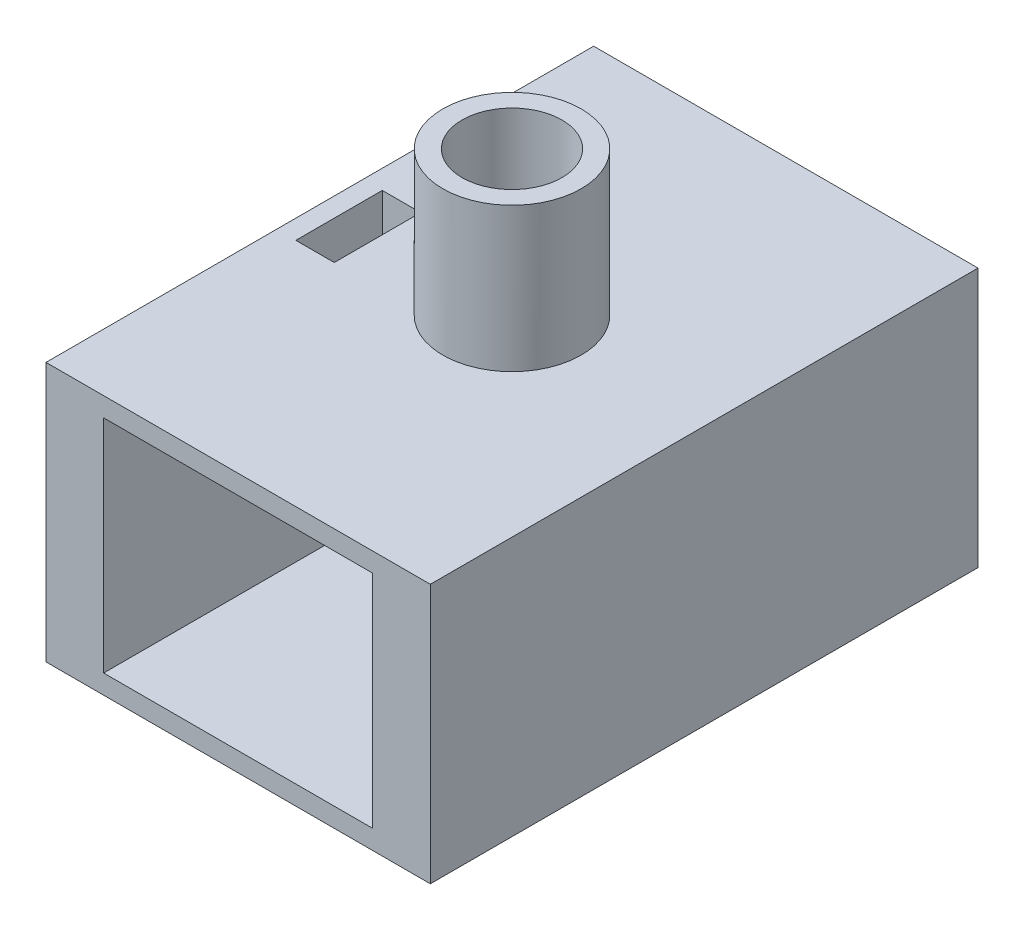
ISO-10303-21;
HEADER;
FILE_DESCRIPTION(('STEP AP214'),'2;1');
FILE_NAME('part.step','',(''),(''),'','','');
FILE_SCHEMA(('AUTOMOTIVE_DESIGN { 1 0 10303 214 1 1 1 1 }'));
ENDSEC;
DATA;
#1=APPLICATION_CONTEXT('core data for automotive mechanical design processes');
#2=APPLICATION_PROTOCOL_DEFINITION('international standard','automotive_design',2000,#1);
#3=PRODUCT_CONTEXT('',#1,'mechanical');
#4=PRODUCT('Part','Part','',(#3));
#5=PRODUCT_RELATED_PRODUCT_CATEGORY('part','',(#4));
#6=PRODUCT_DEFINITION_FORMATION('','',#4);
#7=PRODUCT_DEFINITION_CONTEXT('part definition',#1,'design');
#8=PRODUCT_DEFINITION('design','',#6,#7);
#9=PRODUCT_DEFINITION_SHAPE('','',#8);
#10=(LENGTH_UNIT() NAMED_UNIT(*) SI_UNIT(.MILLI.,.METRE.));
#11=(NAMED_UNIT(*) PLANE_ANGLE_UNIT() SI_UNIT($,.RADIAN.));
#12=(NAMED_UNIT(*) SI_UNIT($,.STERADIAN.) SOLID_ANGLE_UNIT());
#13=UNCERTAINTY_MEASURE_WITH_UNIT(LENGTH_MEASURE(1.E-05),#10,'distance_accuracy_value','');
#14=(GEOMETRIC_REPRESENTATION_CONTEXT(3) GLOBAL_UNCERTAINTY_ASSIGNED_CONTEXT((#13)) GLOBAL_UNIT_ASSIGNED_CONTEXT((#10,
#11,#12)) REPRESENTATION_CONTEXT('',''));
#15=CARTESIAN_POINT('',(0.,0.,0.));
#16=DIRECTION('',(0.,0.,1.));
#17=DIRECTION('',(1.,0.,0.));
#18=AXIS2_PLACEMENT_3D('',#15,#16,#17);
#19=CARTESIAN_POINT('',(0.,13.5,0.));
#20=DIRECTION('',(0.,-1.,0.));
#21=DIRECTION('',(0.,0.,-1.));
#22=AXIS2_PLACEMENT_3D('',#19,#20,#21);
#23=PLANE('',#22);
#24=CARTESIAN_POINT('',(0.,13.5,0.));
#25=DIRECTION('',(0.,1.,0.));
#26=DIRECTION('',(0.,0.,1.));
#27=AXIS2_PLACEMENT_3D('',#24,#25,#26);
#28=CIRCLE('',#27,4.);
#29=CARTESIAN_POINT('',(0.,13.5,4.));
#30=VERTEX_POINT('',#29);
#31=EDGE_CURVE('E182',#30,#30,#28,.T.);
#32=ORIENTED_EDGE('',*,*,#31,.F.);
#33=EDGE_LOOP('',(#32));
#34=FACE_BOUND('',#33,.T.);
#35=CARTESIAN_POINT('',(0.,13.5,0.));
#36=DIRECTION('',(0.,1.,0.));
#37=DIRECTION('',(0.,0.,1.));
#38=AXIS2_PLACEMENT_3D('',#35,#36,#37);
#39=CIRCLE('',#38,5.2);
#40=CARTESIAN_POINT('',(0.,13.5,5.2));
#41=VERTEX_POINT('',#40);
#42=EDGE_CURVE('E167',#41,#41,#39,.T.);
#43=ORIENTED_EDGE('',*,*,#42,.T.);
#44=EDGE_LOOP('',(#43));
#45=FACE_BOUND('',#44,.T.);
#46=ADVANCED_FACE('F35',(#34,#45),#23,.F.);
#47=CARTESIAN_POINT('',(20.,13.5,28.5));
#48=DIRECTION('',(-1.,0.,0.));
#49=DIRECTION('',(0.,0.,1.));
#50=AXIS2_PLACEMENT_3D('',#47,#48,#49);
#51=PLANE('',#50);
#52=DIRECTION('',(0.,0.,-1.));
#53=VECTOR('',#52,1.);
#54=CARTESIAN_POINT('',(20.,-13.5,28.5));
#55=LINE('',#54,#53);
#56=CARTESIAN_POINT('',(20.,-13.5,28.5));
#57=VERTEX_POINT('',#56);
#58=CARTESIAN_POINT('',(20.,-13.5,-28.5));
#59=VERTEX_POINT('',#58);
#60=EDGE_CURVE('E211',#57,#59,#55,.T.);
#61=ORIENTED_EDGE('',*,*,#60,.T.);
#62=DIRECTION('',(0.,-1.,0.));
#63=VECTOR('',#62,1.);
#64=CARTESIAN_POINT('',(20.,13.5,-28.5));
#65=LINE('',#64,#63);
#66=CARTESIAN_POINT('',(20.,13.5,-28.5));
#67=VERTEX_POINT('',#66);
#68=EDGE_CURVE('E43',#67,#59,#65,.T.);
#69=ORIENTED_EDGE('',*,*,#68,.F.);
#70=DIRECTION('',(0.,0.,-1.));
#71=VECTOR('',#70,1.);
#72=CARTESIAN_POINT('',(20.,13.5,28.5));
#73=LINE('',#72,#71);
#74=CARTESIAN_POINT('',(20.,13.5,28.5));
#75=VERTEX_POINT('',#74);
#76=EDGE_CURVE('E221',#75,#67,#73,.T.);
#77=ORIENTED_EDGE('',*,*,#76,.F.);
#78=DIRECTION('',(0.,-1.,0.));
#79=VECTOR('',#78,1.);
#80=CARTESIAN_POINT('',(20.,13.5,28.5));
#81=LINE('',#80,#79);
#82=EDGE_CURVE('E231',#75,#57,#81,.T.);
#83=ORIENTED_EDGE('',*,*,#82,.T.);
#84=EDGE_LOOP('',(#61,#69,#77,#83));
#85=FACE_BOUND('',#84,.T.);
#86=ADVANCED_FACE('F37',(#85),#51,.F.);
#87=CARTESIAN_POINT('',(-20.,13.5,-28.5));
#88=DIRECTION('',(0.,0.,1.));
#89=DIRECTION('',(1.,0.,0.));
#90=AXIS2_PLACEMENT_3D('',#87,#88,#89);
#91=PLANE('',#90);
#92=DIRECTION('',(-1.,0.,0.));
#93=VECTOR('',#92,1.);
#94=CARTESIAN_POINT('',(-20.,-13.5,-28.5));
#95=LINE('',#94,#93);
#96=CARTESIAN_POINT('',(-20.,-13.5,-28.5));
#97=VERTEX_POINT('',#96);
#98=EDGE_CURVE('E234',#59,#97,#95,.T.);
#99=ORIENTED_EDGE('',*,*,#98,.T.);
#100=DIRECTION('',(0.,-1.,0.));
#101=VECTOR('',#100,1.);
#102=CARTESIAN_POINT('',(-20.,13.5,-28.5));
#103=LINE('',#102,#101);
#104=CARTESIAN_POINT('',(-20.,13.5,-28.5));
#105=VERTEX_POINT('',#104);
#106=EDGE_CURVE('E244',#105,#97,#103,.T.);
#107=ORIENTED_EDGE('',*,*,#106,.F.);
#108=DIRECTION('',(-1.,0.,0.));
#109=VECTOR('',#108,1.);
#110=CARTESIAN_POINT('',(-20.,13.5,-28.5));
#111=LINE('',#110,#109);
#112=EDGE_CURVE('E224',#67,#105,#111,.T.);
#113=ORIENTED_EDGE('',*,*,#112,.F.);
#114=ORIENTED_EDGE('',*,*,#68,.T.);
#115=EDGE_LOOP('',(#99,#107,#113,#114));
#116=FACE_BOUND('',#115,.T.);
#117=ADVANCED_FACE('F249',(#116),#91,.F.);
#118=CARTESIAN_POINT('',(-20.,13.5,28.5));
#119=DIRECTION('',(1.,0.,0.));
#120=DIRECTION('',(0.,0.,-1.));
#121=AXIS2_PLACEMENT_3D('',#118,#119,#120);
#122=PLANE('',#121);
#123=DIRECTION('',(0.,0.,1.));
#124=VECTOR('',#123,1.);
#125=CARTESIAN_POINT('',(-20.,-13.5,28.5));
#126=LINE('',#125,#124);
#127=CARTESIAN_POINT('',(-20.,-13.5,28.5));
#128=VERTEX_POINT('',#127);
#129=EDGE_CURVE('E236',#97,#128,#126,.T.);
#130=ORIENTED_EDGE('',*,*,#129,.T.);
#131=DIRECTION('',(0.,-1.,0.));
#132=VECTOR('',#131,1.);
#133=CARTESIAN_POINT('',(-20.,13.5,28.5));
#134=LINE('',#133,#132);
#135=CARTESIAN_POINT('',(-20.,13.5,28.5));
#136=VERTEX_POINT('',#135);
#137=EDGE_CURVE('E241',#136,#128,#134,.T.);
#138=ORIENTED_EDGE('',*,*,#137,.F.);
#139=DIRECTION('',(0.,0.,1.));
#140=VECTOR('',#139,1.);
#141=CARTESIAN_POINT('',(-20.,13.5,28.5));
#142=LINE('',#141,#140);
#143=EDGE_CURVE('E227',#105,#136,#142,.T.);
#144=ORIENTED_EDGE('',*,*,#143,.F.);
#145=ORIENTED_EDGE('',*,*,#106,.T.);
#146=EDGE_LOOP('',(#130,#138,#144,#145));
#147=FACE_BOUND('',#146,.T.);
#148=ADVANCED_FACE('F261',(#147),#122,.F.);
#149=CARTESIAN_POINT('',(-20.,13.5,28.5));
#150=DIRECTION('',(0.,0.,-1.));
#151=DIRECTION('',(-1.,0.,0.));
#152=AXIS2_PLACEMENT_3D('',#149,#150,#151);
#153=PLANE('',#152);
#154=DIRECTION('',(-1.,0.,0.));
#155=VECTOR('',#154,1.);
#156=CARTESIAN_POINT('',(-14.,11.5,28.5));
#157=LINE('',#156,#155);
#158=CARTESIAN_POINT('',(14.,11.5,28.5));
#159=VERTEX_POINT('',#158);
#160=CARTESIAN_POINT('',(-14.,11.5,28.5));
#161=VERTEX_POINT('',#160);
#162=EDGE_CURVE('E201',#159,#161,#157,.T.);
#163=ORIENTED_EDGE('',*,*,#162,.F.);
#164=DIRECTION('',(0.,1.,0.));
#165=VECTOR('',#164,1.);
#166=CARTESIAN_POINT('',(14.,-11.5,28.5));
#167=LINE('',#166,#165);
#168=CARTESIAN_POINT('',(14.,-11.5,28.5));
#169=VERTEX_POINT('',#168);
#170=EDGE_CURVE('E185',#169,#159,#167,.T.);
#171=ORIENTED_EDGE('',*,*,#170,.F.);
#172=DIRECTION('',(1.,0.,0.));
#173=VECTOR('',#172,1.);
#174=CARTESIAN_POINT('',(-14.,-11.5,28.5));
#175=LINE('',#174,#173);
#176=CARTESIAN_POINT('',(-14.,-11.5,28.5));
#177=VERTEX_POINT('',#176);
#178=EDGE_CURVE('E190',#177,#169,#175,.T.);
#179=ORIENTED_EDGE('',*,*,#178,.F.);
#180=DIRECTION('',(0.,-1.,0.));
#181=VECTOR('',#180,1.);
#182=CARTESIAN_POINT('',(-14.,-11.5,28.5));
#183=LINE('',#182,#181);
#184=EDGE_CURVE('E204',#161,#177,#183,.T.);
#185=ORIENTED_EDGE('',*,*,#184,.F.);
#186=EDGE_LOOP('',(#163,#171,#179,#185));
#187=FACE_BOUND('',#186,.T.);
#188=DIRECTION('',(1.,0.,0.));
#189=VECTOR('',#188,1.);
#190=CARTESIAN_POINT('',(-20.,-13.5,28.5));
#191=LINE('',#190,#189);
#192=EDGE_CURVE('E225',#128,#57,#191,.T.);
#193=ORIENTED_EDGE('',*,*,#192,.T.);
#194=ORIENTED_EDGE('',*,*,#82,.F.);
#195=DIRECTION('',(1.,0.,0.));
#196=VECTOR('',#195,1.);
#197=CARTESIAN_POINT('',(-20.,13.5,28.5));
#198=LINE('',#197,#196);
#199=EDGE_CURVE('E229',#136,#75,#198,.T.);
#200=ORIENTED_EDGE('',*,*,#199,.F.);
#201=ORIENTED_EDGE('',*,*,#137,.T.);
#202=EDGE_LOOP('',(#193,#194,#200,#201));
#203=FACE_BOUND('',#202,.T.);
#204=ADVANCED_FACE('F265',(#187,#203),#153,.F.);
#205=DIRECTION('',(1.,0.,0.));
#206=VECTOR('',#205,1.);
#207=CARTESIAN_POINT('',(-18.,13.5,4.5));
#208=LINE('',#207,#206);
#209=CARTESIAN_POINT('',(-18.,13.5,4.5));
#210=VERTEX_POINT('',#209);
#211=CARTESIAN_POINT('',(-14.,13.5,4.5));
#212=VERTEX_POINT('',#211);
#213=EDGE_CURVE('E161',#210,#212,#208,.T.);
#214=ORIENTED_EDGE('',*,*,#213,.F.);
#215=DIRECTION('',(0.,0.,1.));
#216=VECTOR('',#215,1.);
#217=CARTESIAN_POINT('',(-18.,13.5,-4.5));
#218=LINE('',#217,#216);
#219=CARTESIAN_POINT('',(-18.,13.5,-4.5));
#220=VERTEX_POINT('',#219);
#221=EDGE_CURVE('E50',#220,#210,#218,.T.);
#222=ORIENTED_EDGE('',*,*,#221,.F.);
#223=DIRECTION('',(-1.,0.,0.));
#224=VECTOR('',#223,1.);
#225=CARTESIAN_POINT('',(-18.,13.5,-4.5));
#226=LINE('',#225,#224);
#227=CARTESIAN_POINT('',(-14.,13.5,-4.5));
#228=VERTEX_POINT('',#227);
#229=EDGE_CURVE('E152',#228,#220,#226,.T.);
#230=ORIENTED_EDGE('',*,*,#229,.F.);
#231=DIRECTION('',(0.,0.,-1.));
#232=VECTOR('',#231,1.);
#233=CARTESIAN_POINT('',(-14.,13.5,-4.5));
#234=LINE('',#233,#232);
#235=EDGE_CURVE('E155',#212,#228,#234,.T.);
#236=ORIENTED_EDGE('',*,*,#235,.F.);
#237=EDGE_LOOP('',(#214,#222,#230,#236));
#238=FACE_BOUND('',#237,.T.);
#239=CARTESIAN_POINT('',(0.,13.5,0.));
#240=DIRECTION('',(0.,-1.,0.));
#241=DIRECTION('',(0.,0.,-1.));
#242=AXIS2_PLACEMENT_3D('',#239,#240,#241);
#243=CIRCLE('',#242,7.2);
#244=CARTESIAN_POINT('',(0.,13.5,-7.2));
#245=VERTEX_POINT('',#244);
#246=EDGE_CURVE('E11',#245,#245,#243,.F.);
#247=ORIENTED_EDGE('',*,*,#246,.F.);
#248=EDGE_LOOP('',(#247));
#249=FACE_BOUND('',#248,.T.);
#250=ORIENTED_EDGE('',*,*,#76,.T.);
#251=ORIENTED_EDGE('',*,*,#112,.T.);
#252=ORIENTED_EDGE('',*,*,#143,.T.);
#253=ORIENTED_EDGE('',*,*,#199,.T.);
#254=EDGE_LOOP('',(#250,#251,#252,#253));
#255=FACE_BOUND('',#254,.T.);
#256=ADVANCED_FACE('F267',(#238,#249,#255),#23,.F.);
#257=CARTESIAN_POINT('',(0.,-13.5,0.));
#258=DIRECTION('',(0.,-1.,0.));
#259=DIRECTION('',(0.,0.,-1.));
#260=AXIS2_PLACEMENT_3D('',#257,#258,#259);
#261=PLANE('',#260);
#262=ORIENTED_EDGE('',*,*,#60,.F.);
#263=ORIENTED_EDGE('',*,*,#192,.F.);
#264=ORIENTED_EDGE('',*,*,#129,.F.);
#265=ORIENTED_EDGE('',*,*,#98,.F.);
#266=EDGE_LOOP('',(#262,#263,#264,#265));
#267=FACE_BOUND('',#266,.T.);
#268=ADVANCED_FACE('F257',(#267),#261,.T.);
#269=CARTESIAN_POINT('',(14.,-11.5,-26.5));
#270=DIRECTION('',(1.,0.,0.));
#271=DIRECTION('',(0.,0.,-1.));
#272=AXIS2_PLACEMENT_3D('',#269,#270,#271);
#273=PLANE('',#272);
#274=ORIENTED_EDGE('',*,*,#170,.T.);
#275=DIRECTION('',(0.,0.,1.));
#276=VECTOR('',#275,1.);
#277=CARTESIAN_POINT('',(14.,11.5,-26.5));
#278=LINE('',#277,#276);
#279=CARTESIAN_POINT('',(14.,11.5,-26.5));
#280=VERTEX_POINT('',#279);
#281=EDGE_CURVE('E199',#280,#159,#278,.T.);
#282=ORIENTED_EDGE('',*,*,#281,.F.);
#283=DIRECTION('',(0.,1.,0.));
#284=VECTOR('',#283,1.);
#285=CARTESIAN_POINT('',(14.,-11.5,-26.5));
#286=LINE('',#285,#284);
#287=CARTESIAN_POINT('',(14.,-11.5,-26.5));
#288=VERTEX_POINT('',#287);
#289=EDGE_CURVE('E186',#288,#280,#286,.T.);
#290=ORIENTED_EDGE('',*,*,#289,.F.);
#291=DIRECTION('',(0.,0.,1.));
#292=VECTOR('',#291,1.);
#293=CARTESIAN_POINT('',(14.,-11.5,-26.5));
#294=LINE('',#293,#292);
#295=EDGE_CURVE('E209',#288,#169,#294,.T.);
#296=ORIENTED_EDGE('',*,*,#295,.T.);
#297=EDGE_LOOP('',(#274,#282,#290,#296));
#298=FACE_BOUND('',#297,.T.);
#299=ADVANCED_FACE('F275',(#298),#273,.F.);
#300=CARTESIAN_POINT('',(-14.,-11.5,-26.5));
#301=DIRECTION('',(0.,-1.,0.));
#302=DIRECTION('',(0.,0.,-1.));
#303=AXIS2_PLACEMENT_3D('',#300,#301,#302);
#304=PLANE('',#303);
#305=ORIENTED_EDGE('',*,*,#178,.T.);
#306=ORIENTED_EDGE('',*,*,#295,.F.);
#307=DIRECTION('',(1.,0.,0.));
#308=VECTOR('',#307,1.);
#309=CARTESIAN_POINT('',(-14.,-11.5,-26.5));
#310=LINE('',#309,#308);
#311=CARTESIAN_POINT('',(-14.,-11.5,-26.5));
#312=VERTEX_POINT('',#311);
#313=EDGE_CURVE('E196',#312,#288,#310,.T.);
#314=ORIENTED_EDGE('',*,*,#313,.F.);
#315=DIRECTION('',(0.,0.,1.));
#316=VECTOR('',#315,1.);
#317=CARTESIAN_POINT('',(-14.,-11.5,-26.5));
#318=LINE('',#317,#316);
#319=EDGE_CURVE('E212',#312,#177,#318,.T.);
#320=ORIENTED_EDGE('',*,*,#319,.T.);
#321=EDGE_LOOP('',(#305,#306,#314,#320));
#322=FACE_BOUND('',#321,.T.);
#323=ADVANCED_FACE('F312',(#322),#304,.F.);
#324=CARTESIAN_POINT('',(-14.,-11.5,-26.5));
#325=DIRECTION('',(-1.,0.,0.));
#326=DIRECTION('',(0.,0.,1.));
#327=AXIS2_PLACEMENT_3D('',#324,#325,#326);
#328=PLANE('',#327);
#329=DIRECTION('',(0.,0.,1.));
#330=VECTOR('',#329,1.);
#331=CARTESIAN_POINT('',(-14.,11.5,-26.5));
#332=LINE('',#331,#330);
#333=CARTESIAN_POINT('',(-14.,11.5,-26.5));
#334=VERTEX_POINT('',#333);
#335=CARTESIAN_POINT('',(-14.,11.5,-4.5));
#336=VERTEX_POINT('',#335);
#337=EDGE_CURVE('E214',#334,#336,#332,.T.);
#338=ORIENTED_EDGE('',*,*,#337,.T.);
#339=DIRECTION('',(0.,1.,0.));
#340=VECTOR('',#339,1.);
#341=CARTESIAN_POINT('',(-14.,-6.5,-4.5));
#342=LINE('',#341,#340);
#343=CARTESIAN_POINT('',(-14.,-6.5,-4.5));
#344=VERTEX_POINT('',#343);
#345=EDGE_CURVE('E58',#344,#336,#342,.T.);
#346=ORIENTED_EDGE('',*,*,#345,.F.);
#347=DIRECTION('',(0.,0.,-1.));
#348=VECTOR('',#347,1.);
#349=CARTESIAN_POINT('',(-14.,-6.5,-4.5));
#350=LINE('',#349,#348);
#351=CARTESIAN_POINT('',(-14.,-6.5,4.5));
#352=VERTEX_POINT('',#351);
#353=EDGE_CURVE('E149',#352,#344,#350,.T.);
#354=ORIENTED_EDGE('',*,*,#353,.F.);
#355=DIRECTION('',(0.,1.,0.));
#356=VECTOR('',#355,1.);
#357=CARTESIAN_POINT('',(-14.,-6.5,4.5));
#358=LINE('',#357,#356);
#359=CARTESIAN_POINT('',(-14.,11.5,4.5));
#360=VERTEX_POINT('',#359);
#361=EDGE_CURVE('E146',#352,#360,#358,.T.);
#362=ORIENTED_EDGE('',*,*,#361,.T.);
#363=EDGE_CURVE('E218',#360,#161,#332,.T.);
#364=ORIENTED_EDGE('',*,*,#363,.T.);
#365=ORIENTED_EDGE('',*,*,#184,.T.);
#366=ORIENTED_EDGE('',*,*,#319,.F.);
#367=DIRECTION('',(0.,-1.,0.));
#368=VECTOR('',#367,1.);
#369=CARTESIAN_POINT('',(-14.,-11.5,-26.5));
#370=LINE('',#369,#368);
#371=EDGE_CURVE('E193',#334,#312,#370,.T.);
#372=ORIENTED_EDGE('',*,*,#371,.F.);
#373=EDGE_LOOP('',(#338,#346,#354,#362,#364,#365,#366,#372));
#374=FACE_BOUND('',#373,.T.);
#375=ADVANCED_FACE('F315',(#374),#328,.F.);
#376=CARTESIAN_POINT('',(-14.,11.5,-26.5));
#377=DIRECTION('',(0.,1.,0.));
#378=DIRECTION('',(0.,0.,1.));
#379=AXIS2_PLACEMENT_3D('',#376,#377,#378);
#380=PLANE('',#379);
#381=CARTESIAN_POINT('',(0.,11.5,0.));
#382=DIRECTION('',(0.,1.,0.));
#383=DIRECTION('',(0.,0.,1.));
#384=AXIS2_PLACEMENT_3D('',#381,#382,#383);
#385=CIRCLE('',#384,4.);
#386=CARTESIAN_POINT('',(0.,11.5,4.));
#387=VERTEX_POINT('',#386);
#388=EDGE_CURVE('E177',#387,#387,#385,.F.);
#389=ORIENTED_EDGE('',*,*,#388,.F.);
#390=EDGE_LOOP('',(#389));
#391=FACE_BOUND('',#390,.T.);
#392=ORIENTED_EDGE('',*,*,#162,.T.);
#393=ORIENTED_EDGE('',*,*,#363,.F.);
#394=EDGE_CURVE('E217',#336,#360,#332,.T.);
#395=ORIENTED_EDGE('',*,*,#394,.F.);
#396=ORIENTED_EDGE('',*,*,#337,.F.);
#397=DIRECTION('',(-1.,0.,0.));
#398=VECTOR('',#397,1.);
#399=CARTESIAN_POINT('',(-14.,11.5,-26.5));
#400=LINE('',#399,#398);
#401=EDGE_CURVE('E189',#280,#334,#400,.T.);
#402=ORIENTED_EDGE('',*,*,#401,.F.);
#403=ORIENTED_EDGE('',*,*,#281,.T.);
#404=EDGE_LOOP('',(#392,#393,#395,#396,#402,#403));
#405=FACE_BOUND('',#404,.T.);
#406=ADVANCED_FACE('F310',(#391,#405),#380,.F.);
#407=CARTESIAN_POINT('',(0.,0.,-26.5));
#408=DIRECTION('',(0.,0.,-1.));
#409=DIRECTION('',(-1.,0.,0.));
#410=AXIS2_PLACEMENT_3D('',#407,#408,#409);
#411=PLANE('',#410);
#412=ORIENTED_EDGE('',*,*,#289,.T.);
#413=ORIENTED_EDGE('',*,*,#401,.T.);
#414=ORIENTED_EDGE('',*,*,#371,.T.);
#415=ORIENTED_EDGE('',*,*,#313,.T.);
#416=EDGE_LOOP('',(#412,#413,#414,#415));
#417=FACE_BOUND('',#416,.T.);
#418=ADVANCED_FACE('F303',(#417),#411,.F.);
#419=CARTESIAN_POINT('',(0.,-13.501,0.));
#420=DIRECTION('',(0.,1.,0.));
#421=DIRECTION('',(0.,0.,1.));
#422=AXIS2_PLACEMENT_3D('',#419,#420,#421);
#423=CYLINDRICAL_SURFACE('',#422,4.);
#424=ORIENTED_EDGE('',*,*,#31,.T.);
#425=EDGE_LOOP('',(#424));
#426=FACE_BOUND('',#425,.T.);
#427=ORIENTED_EDGE('',*,*,#388,.T.);
#428=EDGE_LOOP('',(#427));
#429=FACE_BOUND('',#428,.T.);
#430=ADVANCED_FACE('F293',(#426,#429),#423,.F.);
#431=CARTESIAN_POINT('',(0.,28.5,0.));
#432=DIRECTION('',(0.,-1.,0.));
#433=DIRECTION('',(0.,0.,-1.));
#434=AXIS2_PLACEMENT_3D('',#431,#432,#433);
#435=CYLINDRICAL_SURFACE('',#434,5.2);
#436=CARTESIAN_POINT('',(0.,28.5,0.));
#437=DIRECTION('',(0.,1.,0.));
#438=DIRECTION('',(0.,0.,1.));
#439=AXIS2_PLACEMENT_3D('',#436,#437,#438);
#440=CIRCLE('',#439,5.2);
#441=CARTESIAN_POINT('',(0.,28.5,5.2));
#442=VERTEX_POINT('',#441);
#443=EDGE_CURVE('E171',#442,#442,#440,.T.);
#444=ORIENTED_EDGE('',*,*,#443,.T.);
#445=EDGE_LOOP('',(#444));
#446=FACE_BOUND('',#445,.T.);
#447=ORIENTED_EDGE('',*,*,#42,.F.);
#448=EDGE_LOOP('',(#447));
#449=FACE_BOUND('',#448,.T.);
#450=ADVANCED_FACE('F290',(#446,#449),#435,.F.);
#451=CARTESIAN_POINT('',(0.,28.5,0.));
#452=DIRECTION('',(0.,-1.,0.));
#453=DIRECTION('',(0.,0.,-1.));
#454=AXIS2_PLACEMENT_3D('',#451,#452,#453);
#455=CYLINDRICAL_SURFACE('',#454,7.2);
#456=CARTESIAN_POINT('',(0.,28.5,0.));
#457=DIRECTION('',(0.,1.,0.));
#458=DIRECTION('',(0.,0.,1.));
#459=AXIS2_PLACEMENT_3D('',#456,#457,#458);
#460=CIRCLE('',#459,7.2);
#461=CARTESIAN_POINT('',(0.,28.5,7.2));
#462=VERTEX_POINT('',#461);
#463=EDGE_CURVE('E174',#462,#462,#460,.T.);
#464=ORIENTED_EDGE('',*,*,#463,.F.);
#465=EDGE_LOOP('',(#464));
#466=FACE_BOUND('',#465,.T.);
#467=ORIENTED_EDGE('',*,*,#246,.T.);
#468=EDGE_LOOP('',(#467));
#469=FACE_BOUND('',#468,.T.);
#470=ADVANCED_FACE('F292',(#466,#469),#455,.T.);
#471=CARTESIAN_POINT('',(0.,28.5,0.));
#472=DIRECTION('',(0.,1.,0.));
#473=DIRECTION('',(0.,0.,1.));
#474=AXIS2_PLACEMENT_3D('',#471,#472,#473);
#475=PLANE('',#474);
#476=ORIENTED_EDGE('',*,*,#443,.F.);
#477=EDGE_LOOP('',(#476));
#478=FACE_BOUND('',#477,.T.);
#479=ORIENTED_EDGE('',*,*,#463,.T.);
#480=EDGE_LOOP('',(#479));
#481=FACE_BOUND('',#480,.T.);
#482=ADVANCED_FACE('F300',(#478,#481),#475,.T.);
#483=CARTESIAN_POINT('',(-14.,-6.5,-4.5));
#484=DIRECTION('',(1.,0.,0.));
#485=DIRECTION('',(0.,0.,-1.));
#486=AXIS2_PLACEMENT_3D('',#483,#484,#485);
#487=PLANE('',#486);
#488=EDGE_CURVE('E138',#360,#212,#358,.T.);
#489=ORIENTED_EDGE('',*,*,#488,.T.);
#490=ORIENTED_EDGE('',*,*,#235,.T.);
#491=EDGE_CURVE('E169',#336,#228,#342,.T.);
#492=ORIENTED_EDGE('',*,*,#491,.F.);
#493=ORIENTED_EDGE('',*,*,#394,.T.);
#494=EDGE_LOOP('',(#489,#490,#492,#493));
#495=FACE_BOUND('',#494,.T.);
#496=ADVANCED_FACE('F337',(#495),#487,.F.);
#497=CARTESIAN_POINT('',(-18.,-6.5,-4.5));
#498=DIRECTION('',(-1.,0.,0.));
#499=DIRECTION('',(0.,0.,1.));
#500=AXIS2_PLACEMENT_3D('',#497,#498,#499);
#501=PLANE('',#500);
#502=ORIENTED_EDGE('',*,*,#221,.T.);
#503=DIRECTION('',(0.,1.,0.));
#504=VECTOR('',#503,1.);
#505=CARTESIAN_POINT('',(-18.,-6.5,4.5));
#506=LINE('',#505,#504);
#507=CARTESIAN_POINT('',(-18.,-6.5,4.5));
#508=VERTEX_POINT('',#507);
#509=EDGE_CURVE('E129',#508,#210,#506,.T.);
#510=ORIENTED_EDGE('',*,*,#509,.F.);
#511=DIRECTION('',(0.,0.,1.));
#512=VECTOR('',#511,1.);
#513=CARTESIAN_POINT('',(-18.,-6.5,-4.5));
#514=LINE('',#513,#512);
#515=CARTESIAN_POINT('',(-18.,-6.5,-4.5));
#516=VERTEX_POINT('',#515);
#517=EDGE_CURVE('E133',#516,#508,#514,.T.);
#518=ORIENTED_EDGE('',*,*,#517,.F.);
#519=DIRECTION('',(0.,1.,0.));
#520=VECTOR('',#519,1.);
#521=CARTESIAN_POINT('',(-18.,-6.5,-4.5));
#522=LINE('',#521,#520);
#523=EDGE_CURVE('E165',#516,#220,#522,.T.);
#524=ORIENTED_EDGE('',*,*,#523,.T.);
#525=EDGE_LOOP('',(#502,#510,#518,#524));
#526=FACE_BOUND('',#525,.T.);
#527=ADVANCED_FACE('F131',(#526),#501,.F.);
#528=CARTESIAN_POINT('',(-18.,-6.5,-4.5));
#529=DIRECTION('',(0.,0.,-1.));
#530=DIRECTION('',(-1.,0.,0.));
#531=AXIS2_PLACEMENT_3D('',#528,#529,#530);
#532=PLANE('',#531);
#533=ORIENTED_EDGE('',*,*,#229,.T.);
#534=ORIENTED_EDGE('',*,*,#523,.F.);
#535=DIRECTION('',(-1.,0.,0.));
#536=VECTOR('',#535,1.);
#537=CARTESIAN_POINT('',(-18.,-6.5,-4.5));
#538=LINE('',#537,#536);
#539=EDGE_CURVE('E139',#344,#516,#538,.T.);
#540=ORIENTED_EDGE('',*,*,#539,.F.);
#541=ORIENTED_EDGE('',*,*,#345,.T.);
#542=ORIENTED_EDGE('',*,*,#491,.T.);
#543=EDGE_LOOP('',(#533,#534,#540,#541,#542));
#544=FACE_BOUND('',#543,.T.);
#545=ADVANCED_FACE('F340',(#544),#532,.F.);
#546=CARTESIAN_POINT('',(-18.,-6.5,4.5));
#547=DIRECTION('',(0.,0.,1.));
#548=DIRECTION('',(1.,0.,0.));
#549=AXIS2_PLACEMENT_3D('',#546,#547,#548);
#550=PLANE('',#549);
#551=ORIENTED_EDGE('',*,*,#213,.T.);
#552=ORIENTED_EDGE('',*,*,#488,.F.);
#553=ORIENTED_EDGE('',*,*,#361,.F.);
#554=DIRECTION('',(1.,0.,0.));
#555=VECTOR('',#554,1.);
#556=CARTESIAN_POINT('',(-18.,-6.5,4.5));
#557=LINE('',#556,#555);
#558=EDGE_CURVE('E142',#508,#352,#557,.T.);
#559=ORIENTED_EDGE('',*,*,#558,.F.);
#560=ORIENTED_EDGE('',*,*,#509,.T.);
#561=EDGE_LOOP('',(#551,#552,#553,#559,#560));
#562=FACE_BOUND('',#561,.T.);
#563=ADVANCED_FACE('F143',(#562),#550,.F.);
#564=CARTESIAN_POINT('',(0.,-6.5,0.));
#565=DIRECTION('',(0.,1.,0.));
#566=DIRECTION('',(0.,0.,1.));
#567=AXIS2_PLACEMENT_3D('',#564,#565,#566);
#568=PLANE('',#567);
#569=ORIENTED_EDGE('',*,*,#517,.T.);
#570=ORIENTED_EDGE('',*,*,#558,.T.);
#571=ORIENTED_EDGE('',*,*,#353,.T.);
#572=ORIENTED_EDGE('',*,*,#539,.T.);
#573=EDGE_LOOP('',(#569,#570,#571,#572));
#574=FACE_BOUND('',#573,.T.);
#575=ADVANCED_FACE('F151',(#574),#568,.T.);
#576=CLOSED_SHELL('',(#46,#86,#117,#148,#204,#256,#268,#299,#323,#375,#406,#418,#430,#450,#470,
#482,#496,#527,#545,#563,#575));
#577=MANIFOLD_SOLID_BREP('B2',#576);
#578=ADVANCED_BREP_SHAPE_REPRESENTATION('',(#18,#577),#14);
#579=SHAPE_DEFINITION_REPRESENTATION(#9,#578);
ENDSEC;
END-ISO-10303-21;
